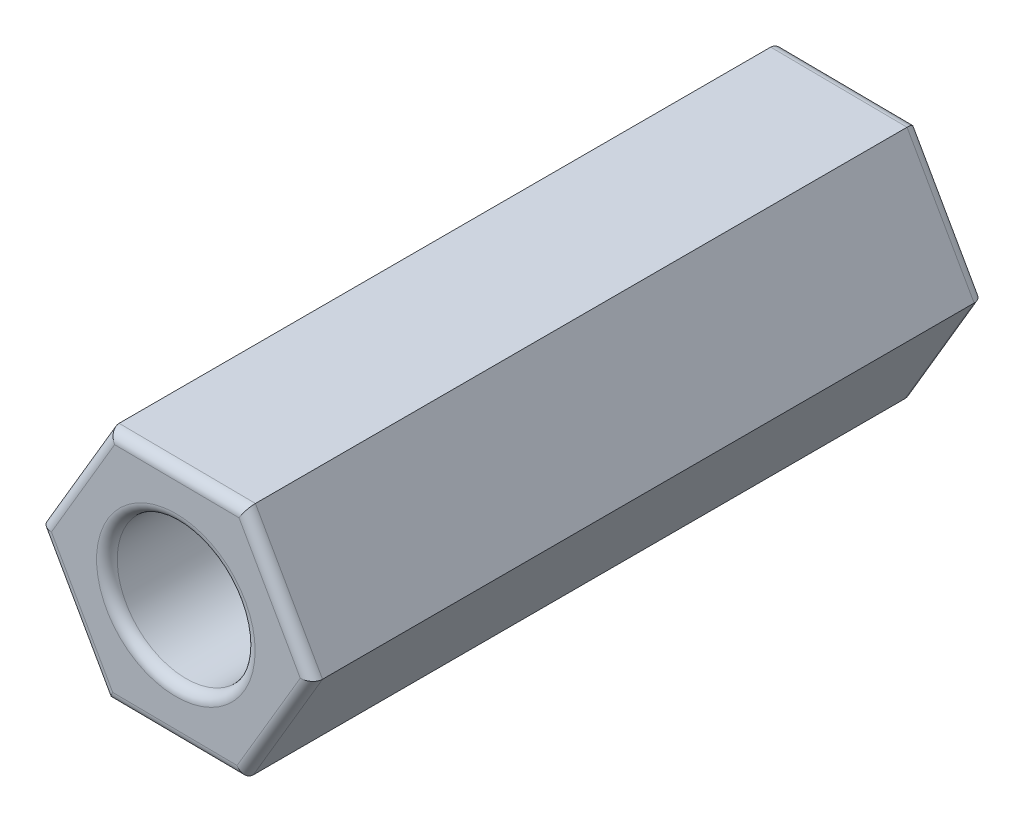
ISO-10303-21;
HEADER;
FILE_DESCRIPTION(('STEP AP214'),'2;1');
FILE_NAME('part.step','',(''),(''),'','','');
FILE_SCHEMA(('AUTOMOTIVE_DESIGN { 1 0 10303 214 1 1 1 1 }'));
ENDSEC;
DATA;
#1=APPLICATION_CONTEXT('core data for automotive mechanical design processes');
#2=APPLICATION_PROTOCOL_DEFINITION('international standard','automotive_design',2000,#1);
#3=PRODUCT_CONTEXT('',#1,'mechanical');
#4=PRODUCT('Part','Part','',(#3));
#5=PRODUCT_RELATED_PRODUCT_CATEGORY('part','',(#4));
#6=PRODUCT_DEFINITION_FORMATION('','',#4);
#7=PRODUCT_DEFINITION_CONTEXT('part definition',#1,'design');
#8=PRODUCT_DEFINITION('design','',#6,#7);
#9=PRODUCT_DEFINITION_SHAPE('','',#8);
#10=(LENGTH_UNIT() NAMED_UNIT(*) SI_UNIT(.MILLI.,.METRE.));
#11=(NAMED_UNIT(*) PLANE_ANGLE_UNIT() SI_UNIT($,.RADIAN.));
#12=(NAMED_UNIT(*) SI_UNIT($,.STERADIAN.) SOLID_ANGLE_UNIT());
#13=UNCERTAINTY_MEASURE_WITH_UNIT(LENGTH_MEASURE(1.E-05),#10,'distance_accuracy_value','');
#14=(GEOMETRIC_REPRESENTATION_CONTEXT(3) GLOBAL_UNCERTAINTY_ASSIGNED_CONTEXT((#13)) GLOBAL_UNIT_ASSIGNED_CONTEXT((#10,
#11,#12)) REPRESENTATION_CONTEXT('',''));
#15=CARTESIAN_POINT('',(0.,0.,0.));
#16=DIRECTION('',(0.,0.,1.));
#17=DIRECTION('',(1.,0.,0.));
#18=AXIS2_PLACEMENT_3D('',#15,#16,#17);
#19=CARTESIAN_POINT('',(-1.3228756555323,1.5,7.));
#20=DIRECTION('',(0.,1.,0.));
#21=DIRECTION('',(0.,0.,1.));
#22=AXIS2_PLACEMENT_3D('',#19,#20,#21);
#23=PLANE('',#22);
#24=DIRECTION('',(0.,0.,1.));
#25=VECTOR('',#24,1.);
#26=CARTESIAN_POINT('',(1.3228756555323,1.5,7.));
#27=LINE('',#26,#25);
#28=CARTESIAN_POINT('',(1.3228756555323,1.5,7.));
#29=VERTEX_POINT('',#28);
#30=CARTESIAN_POINT('',(1.3228756555323,1.5,15.3));
#31=VERTEX_POINT('',#30);
#32=EDGE_CURVE('E143',#29,#31,#27,.T.);
#33=ORIENTED_EDGE('',*,*,#32,.T.);
#34=DIRECTION('',(1.,0.,0.));
#35=VECTOR('',#34,1.);
#36=CARTESIAN_POINT('',(-1.3228756555323,1.5,15.3));
#37=LINE('',#36,#35);
#38=CARTESIAN_POINT('',(-1.3228756555323,1.5,15.3));
#39=VERTEX_POINT('',#38);
#40=EDGE_CURVE('E61',#31,#39,#37,.F.);
#41=ORIENTED_EDGE('',*,*,#40,.T.);
#42=DIRECTION('',(0.,0.,1.));
#43=VECTOR('',#42,1.);
#44=CARTESIAN_POINT('',(-1.3228756555323,1.5,7.));
#45=LINE('',#44,#43);
#46=CARTESIAN_POINT('',(-1.3228756555323,1.5,7.));
#47=VERTEX_POINT('',#46);
#48=EDGE_CURVE('E149',#47,#39,#45,.T.);
#49=ORIENTED_EDGE('',*,*,#48,.F.);
#50=DIRECTION('',(-1.,0.,0.));
#51=VECTOR('',#50,1.);
#52=CARTESIAN_POINT('',(-1.3228756555323,1.5,7.));
#53=LINE('',#52,#51);
#54=EDGE_CURVE('E150',#29,#47,#53,.T.);
#55=ORIENTED_EDGE('',*,*,#54,.F.);
#56=EDGE_LOOP('',(#33,#41,#49,#55));
#57=FACE_BOUND('',#56,.T.);
#58=ADVANCED_FACE('F35',(#57),#23,.F.);
#59=CARTESIAN_POINT('',(3.95468757395786,-0.0357704587140529,19.5));
#60=DIRECTION('',(-0.87051233385229,-0.492146600730961,0.));
#61=DIRECTION('',(0.492146600730961,-0.87051233385229,0.));
#62=AXIS2_PLACEMENT_3D('',#59,#60,#61);
#63=PLANE('',#62);
#64=DIRECTION('',(0.,0.,-1.));
#65=VECTOR('',#64,1.);
#66=CARTESIAN_POINT('',(3.95468757395786,-0.0357704587140529,19.5));
#67=LINE('',#66,#65);
#68=CARTESIAN_POINT('',(3.95468757395786,-0.0357704587140529,19.2));
#69=VERTEX_POINT('',#68);
#70=CARTESIAN_POINT('',(3.95468757395786,-0.0357704587140529,0.300000000000002));
#71=VERTEX_POINT('',#70);
#72=EDGE_CURVE('E159',#69,#71,#67,.T.);
#73=ORIENTED_EDGE('',*,*,#72,.T.);
#74=DIRECTION('',(-0.492146600730961,0.87051233385229,0.));
#75=VECTOR('',#74,1.);
#76=CARTESIAN_POINT('',(3.95468757395786,-0.0357704587140529,0.300000000000002));
#77=LINE('',#76,#75);
#78=CARTESIAN_POINT('',(2.00832191293032,3.40697467372113,0.300000000000002));
#79=VERTEX_POINT('',#78);
#80=EDGE_CURVE('E215',#71,#79,#77,.T.);
#81=ORIENTED_EDGE('',*,*,#80,.T.);
#82=DIRECTION('',(0.,0.,-1.));
#83=VECTOR('',#82,1.);
#84=CARTESIAN_POINT('',(2.00832191293032,3.40697467372113,19.5));
#85=LINE('',#84,#83);
#86=CARTESIAN_POINT('',(2.00832191293032,3.40697467372113,19.2));
#87=VERTEX_POINT('',#86);
#88=EDGE_CURVE('E175',#87,#79,#85,.T.);
#89=ORIENTED_EDGE('',*,*,#88,.F.);
#90=DIRECTION('',(-0.492146600730961,0.87051233385229,0.));
#91=VECTOR('',#90,1.);
#92=CARTESIAN_POINT('',(3.95468757395786,-0.0357704587140529,19.2));
#93=LINE('',#92,#91);
#94=EDGE_CURVE('E213',#87,#69,#93,.F.);
#95=ORIENTED_EDGE('',*,*,#94,.T.);
#96=EDGE_LOOP('',(#73,#81,#89,#95));
#97=FACE_BOUND('',#96,.T.);
#98=ADVANCED_FACE('F308',(#97),#63,.F.);
#99=CARTESIAN_POINT('',(2.00832191293032,3.40697467372113,19.5));
#100=DIRECTION('',(-0.00904470830697618,-0.999959095789244,0.));
#101=DIRECTION('',(0.999959095789244,-0.00904470830697618,0.));
#102=AXIS2_PLACEMENT_3D('',#99,#100,#101);
#103=PLANE('',#102);
#104=ORIENTED_EDGE('',*,*,#88,.T.);
#105=DIRECTION('',(-0.999959095789244,0.00904470830697618,0.));
#106=VECTOR('',#105,1.);
#107=CARTESIAN_POINT('',(2.00832191293032,3.40697467372113,0.300000000000002));
#108=LINE('',#107,#106);
#109=CARTESIAN_POINT('',(-1.94636566102754,3.44274513243519,0.300000000000002));
#110=VERTEX_POINT('',#109);
#111=EDGE_CURVE('E180',#79,#110,#108,.T.);
#112=ORIENTED_EDGE('',*,*,#111,.T.);
#113=DIRECTION('',(0.,0.,-1.));
#114=VECTOR('',#113,1.);
#115=CARTESIAN_POINT('',(-1.94636566102754,3.44274513243519,19.5));
#116=LINE('',#115,#114);
#117=CARTESIAN_POINT('',(-1.94636566102754,3.44274513243519,19.2));
#118=VERTEX_POINT('',#117);
#119=EDGE_CURVE('E172',#118,#110,#116,.T.);
#120=ORIENTED_EDGE('',*,*,#119,.F.);
#121=DIRECTION('',(-0.999959095789244,0.00904470830697618,0.));
#122=VECTOR('',#121,1.);
#123=CARTESIAN_POINT('',(2.00832191293032,3.40697467372113,19.2));
#124=LINE('',#123,#122);
#125=EDGE_CURVE('E178',#118,#87,#124,.F.);
#126=ORIENTED_EDGE('',*,*,#125,.T.);
#127=EDGE_LOOP('',(#104,#112,#120,#126));
#128=FACE_BOUND('',#127,.T.);
#129=ADVANCED_FACE('F304',(#128),#103,.F.);
#130=CARTESIAN_POINT('',(-1.94636566102754,3.44274513243519,19.5));
#131=DIRECTION('',(0.861467625545314,-0.507812495058283,0.));
#132=DIRECTION('',(0.507812495058283,0.861467625545314,0.));
#133=AXIS2_PLACEMENT_3D('',#130,#131,#132);
#134=PLANE('',#133);
#135=ORIENTED_EDGE('',*,*,#119,.T.);
#136=DIRECTION('',(-0.507812495058283,-0.861467625545314,0.));
#137=VECTOR('',#136,1.);
#138=CARTESIAN_POINT('',(-1.94636566102754,3.44274513243519,0.300000000000002));
#139=LINE('',#138,#137);
#140=CARTESIAN_POINT('',(-3.95468757395786,0.0357704587140536,0.300000000000002));
#141=VERTEX_POINT('',#140);
#142=EDGE_CURVE('E198',#110,#141,#139,.T.);
#143=ORIENTED_EDGE('',*,*,#142,.T.);
#144=DIRECTION('',(0.,0.,-1.));
#145=VECTOR('',#144,1.);
#146=CARTESIAN_POINT('',(-3.95468757395786,0.0357704587140536,19.5));
#147=LINE('',#146,#145);
#148=CARTESIAN_POINT('',(-3.95468757395786,0.0357704587140536,19.2));
#149=VERTEX_POINT('',#148);
#150=EDGE_CURVE('E169',#149,#141,#147,.T.);
#151=ORIENTED_EDGE('',*,*,#150,.F.);
#152=DIRECTION('',(-0.507812495058283,-0.861467625545314,0.));
#153=VECTOR('',#152,1.);
#154=CARTESIAN_POINT('',(-1.94636566102754,3.44274513243519,19.2));
#155=LINE('',#154,#153);
#156=EDGE_CURVE('E196',#149,#118,#155,.F.);
#157=ORIENTED_EDGE('',*,*,#156,.T.);
#158=EDGE_LOOP('',(#135,#143,#151,#157));
#159=FACE_BOUND('',#158,.T.);
#160=ADVANCED_FACE('F300',(#159),#134,.F.);
#161=CARTESIAN_POINT('',(-3.95468757395786,0.0357704587140536,19.5));
#162=DIRECTION('',(0.87051233385229,0.49214660073096,0.));
#163=DIRECTION('',(-0.49214660073096,0.87051233385229,0.));
#164=AXIS2_PLACEMENT_3D('',#161,#162,#163);
#165=PLANE('',#164);
#166=ORIENTED_EDGE('',*,*,#150,.T.);
#167=DIRECTION('',(0.49214660073096,-0.87051233385229,0.));
#168=VECTOR('',#167,1.);
#169=CARTESIAN_POINT('',(-3.95468757395786,0.0357704587140536,0.300000000000002));
#170=LINE('',#169,#168);
#171=CARTESIAN_POINT('',(-2.00832191293032,-3.40697467372113,0.300000000000002));
#172=VERTEX_POINT('',#171);
#173=EDGE_CURVE('E202',#141,#172,#170,.T.);
#174=ORIENTED_EDGE('',*,*,#173,.T.);
#175=DIRECTION('',(0.,0.,-1.));
#176=VECTOR('',#175,1.);
#177=CARTESIAN_POINT('',(-2.00832191293032,-3.40697467372113,19.5));
#178=LINE('',#177,#176);
#179=CARTESIAN_POINT('',(-2.00832191293032,-3.40697467372113,19.2));
#180=VERTEX_POINT('',#179);
#181=EDGE_CURVE('E166',#180,#172,#178,.T.);
#182=ORIENTED_EDGE('',*,*,#181,.F.);
#183=DIRECTION('',(0.49214660073096,-0.87051233385229,0.));
#184=VECTOR('',#183,1.);
#185=CARTESIAN_POINT('',(-3.95468757395786,0.0357704587140535,19.2));
#186=LINE('',#185,#184);
#187=EDGE_CURVE('E200',#180,#149,#186,.F.);
#188=ORIENTED_EDGE('',*,*,#187,.T.);
#189=EDGE_LOOP('',(#166,#174,#182,#188));
#190=FACE_BOUND('',#189,.T.);
#191=ADVANCED_FACE('F296',(#190),#165,.F.);
#192=CARTESIAN_POINT('',(-2.00832191293032,-3.40697467372113,19.5));
#193=DIRECTION('',(0.00904470830697596,0.999959095789244,0.));
#194=DIRECTION('',(-0.999959095789244,0.00904470830697596,0.));
#195=AXIS2_PLACEMENT_3D('',#192,#193,#194);
#196=PLANE('',#195);
#197=ORIENTED_EDGE('',*,*,#181,.T.);
#198=DIRECTION('',(0.999959095789244,-0.00904470830697596,0.));
#199=VECTOR('',#198,1.);
#200=CARTESIAN_POINT('',(-2.00832191293032,-3.40697467372113,0.300000000000002));
#201=LINE('',#200,#199);
#202=CARTESIAN_POINT('',(1.94636566102754,-3.44274513243519,0.300000000000002));
#203=VERTEX_POINT('',#202);
#204=EDGE_CURVE('E206',#172,#203,#201,.T.);
#205=ORIENTED_EDGE('',*,*,#204,.T.);
#206=DIRECTION('',(0.,0.,-1.));
#207=VECTOR('',#206,1.);
#208=CARTESIAN_POINT('',(1.94636566102754,-3.44274513243519,19.5));
#209=LINE('',#208,#207);
#210=CARTESIAN_POINT('',(1.94636566102754,-3.44274513243519,19.2));
#211=VERTEX_POINT('',#210);
#212=EDGE_CURVE('E163',#211,#203,#209,.T.);
#213=ORIENTED_EDGE('',*,*,#212,.F.);
#214=DIRECTION('',(0.999959095789244,-0.00904470830697596,0.));
#215=VECTOR('',#214,1.);
#216=CARTESIAN_POINT('',(-2.00832191293033,-3.40697467372113,19.2));
#217=LINE('',#216,#215);
#218=EDGE_CURVE('E204',#211,#180,#217,.F.);
#219=ORIENTED_EDGE('',*,*,#218,.T.);
#220=EDGE_LOOP('',(#197,#205,#213,#219));
#221=FACE_BOUND('',#220,.T.);
#222=ADVANCED_FACE('F292',(#221),#196,.F.);
#223=CARTESIAN_POINT('',(1.94636566102754,-3.44274513243519,19.5));
#224=DIRECTION('',(-0.861467625545314,0.507812495058283,0.));
#225=DIRECTION('',(-0.507812495058283,-0.861467625545314,0.));
#226=AXIS2_PLACEMENT_3D('',#223,#224,#225);
#227=PLANE('',#226);
#228=ORIENTED_EDGE('',*,*,#212,.T.);
#229=DIRECTION('',(0.507812495058283,0.861467625545314,0.));
#230=VECTOR('',#229,1.);
#231=CARTESIAN_POINT('',(1.94636566102754,-3.44274513243519,0.300000000000002));
#232=LINE('',#231,#230);
#233=EDGE_CURVE('E211',#203,#71,#232,.T.);
#234=ORIENTED_EDGE('',*,*,#233,.T.);
#235=ORIENTED_EDGE('',*,*,#72,.F.);
#236=DIRECTION('',(0.507812495058283,0.861467625545314,0.));
#237=VECTOR('',#236,1.);
#238=CARTESIAN_POINT('',(1.94636566102754,-3.44274513243519,19.2));
#239=LINE('',#238,#237);
#240=EDGE_CURVE('E208',#69,#211,#239,.F.);
#241=ORIENTED_EDGE('',*,*,#240,.T.);
#242=EDGE_LOOP('',(#228,#234,#235,#241));
#243=FACE_BOUND('',#242,.T.);
#244=ADVANCED_FACE('F285',(#243),#227,.F.);
#245=CARTESIAN_POINT('',(0.,0.,19.5));
#246=DIRECTION('',(0.,0.,1.));
#247=DIRECTION('',(1.,0.,0.));
#248=AXIS2_PLACEMENT_3D('',#245,#246,#247);
#249=PLANE('',#248);
#250=DIRECTION('',(0.999959095789244,-0.00904470830697596,0.));
#251=VECTOR('',#250,1.);
#252=CARTESIAN_POINT('',(1.94907907351963,-3.14275740369841,19.5));
#253=LINE('',#252,#251);
#254=CARTESIAN_POINT('',(-1.83241050449847,-3.10855353441709,19.5));
#255=VERTEX_POINT('',#254);
#256=CARTESIAN_POINT('',(1.77588107757987,-3.14119081426568,19.5));
#257=VERTEX_POINT('',#256);
#258=EDGE_CURVE('E228',#255,#257,#253,.T.);
#259=ORIENTED_EDGE('',*,*,#258,.T.);
#260=DIRECTION('',(0.507812495058283,0.861467625545314,0.));
#261=VECTOR('',#260,1.);
#262=CARTESIAN_POINT('',(3.69624728629427,0.116573289803433,19.5));
#263=LINE('',#262,#261);
#264=CARTESIAN_POINT('',(3.60829158207834,-0.0326372798485885,19.5));
#265=VERTEX_POINT('',#264);
#266=EDGE_CURVE('E230',#257,#265,#263,.T.);
#267=ORIENTED_EDGE('',*,*,#266,.T.);
#268=DIRECTION('',(-0.492146600730961,0.87051233385229,0.));
#269=VECTOR('',#268,1.);
#270=CARTESIAN_POINT('',(1.74716821277464,3.25933069350185,19.5));
#271=LINE('',#270,#269);
#272=CARTESIAN_POINT('',(1.83241050449847,3.10855353441709,19.5));
#273=VERTEX_POINT('',#272);
#274=EDGE_CURVE('E220',#265,#273,#271,.T.);
#275=ORIENTED_EDGE('',*,*,#274,.T.);
#276=DIRECTION('',(-0.999959095789244,0.00904470830697618,0.));
#277=VECTOR('',#276,1.);
#278=CARTESIAN_POINT('',(-1.94907907351963,3.14275740369841,19.5));
#279=LINE('',#278,#277);
#280=CARTESIAN_POINT('',(-1.77588107757987,3.14119081426568,19.5));
#281=VERTEX_POINT('',#280);
#282=EDGE_CURVE('E222',#273,#281,#279,.T.);
#283=ORIENTED_EDGE('',*,*,#282,.T.);
#284=DIRECTION('',(-0.507812495058283,-0.861467625545314,0.));
#285=VECTOR('',#284,1.);
#286=CARTESIAN_POINT('',(-3.69624728629427,-0.116573289803431,19.5));
#287=LINE('',#286,#285);
#288=CARTESIAN_POINT('',(-3.60829158207834,0.0326372798485892,19.5));
#289=VERTEX_POINT('',#288);
#290=EDGE_CURVE('E224',#281,#289,#287,.T.);
#291=ORIENTED_EDGE('',*,*,#290,.T.);
#292=DIRECTION('',(0.49214660073096,-0.87051233385229,0.));
#293=VECTOR('',#292,1.);
#294=CARTESIAN_POINT('',(-1.74716821277464,-3.25933069350184,19.5));
#295=LINE('',#294,#293);
#296=EDGE_CURVE('E226',#289,#255,#295,.T.);
#297=ORIENTED_EDGE('',*,*,#296,.T.);
#298=EDGE_LOOP('',(#259,#267,#275,#283,#291,#297));
#299=FACE_BOUND('',#298,.T.);
#300=CARTESIAN_POINT('',(0.,0.,19.5));
#301=DIRECTION('',(0.,0.,1.));
#302=DIRECTION('',(1.,0.,0.));
#303=AXIS2_PLACEMENT_3D('',#300,#301,#302);
#304=CIRCLE('',#303,2.3);
#305=CARTESIAN_POINT('',(2.3,0.,19.5));
#306=VERTEX_POINT('',#305);
#307=EDGE_CURVE('E217',#306,#306,#304,.F.);
#308=ORIENTED_EDGE('',*,*,#307,.T.);
#309=EDGE_LOOP('',(#308));
#310=FACE_BOUND('',#309,.T.);
#311=ADVANCED_FACE('F281',(#299,#310),#249,.T.);
#312=CARTESIAN_POINT('',(0.,0.,0.));
#313=DIRECTION('',(0.,0.,1.));
#314=DIRECTION('',(1.,0.,0.));
#315=AXIS2_PLACEMENT_3D('',#312,#313,#314);
#316=PLANE('',#315);
#317=DIRECTION('',(-0.507812495058283,-0.861467625545314,0.));
#318=VECTOR('',#317,1.);
#319=CARTESIAN_POINT('',(-2.69208632982911,1.58691404705714,0.));
#320=LINE('',#319,#318);
#321=CARTESIAN_POINT('',(-3.60829158207834,0.0326372798485891,0.));
#322=VERTEX_POINT('',#321);
#323=CARTESIAN_POINT('',(-1.77588107757987,3.14119081426568,0.));
#324=VERTEX_POINT('',#323);
#325=EDGE_CURVE('E191',#322,#324,#320,.F.);
#326=ORIENTED_EDGE('',*,*,#325,.T.);
#327=DIRECTION('',(-0.999959095789244,0.00904470830697618,0.));
#328=VECTOR('',#327,1.);
#329=CARTESIAN_POINT('',(0.0282647134593006,3.12487217434139,0.));
#330=LINE('',#329,#328);
#331=CARTESIAN_POINT('',(1.83241050449847,3.10855353441709,0.));
#332=VERTEX_POINT('',#331);
#333=EDGE_CURVE('E193',#324,#332,#330,.F.);
#334=ORIENTED_EDGE('',*,*,#333,.T.);
#335=DIRECTION('',(-0.492146600730961,0.87051233385229,0.));
#336=VECTOR('',#335,1.);
#337=CARTESIAN_POINT('',(2.72035104328841,1.53795812728425,0.));
#338=LINE('',#337,#336);
#339=CARTESIAN_POINT('',(3.60829158207834,-0.0326372798485882,0.));
#340=VERTEX_POINT('',#339);
#341=EDGE_CURVE('E183',#332,#340,#338,.F.);
#342=ORIENTED_EDGE('',*,*,#341,.T.);
#343=DIRECTION('',(0.507812495058283,0.861467625545314,0.));
#344=VECTOR('',#343,1.);
#345=CARTESIAN_POINT('',(2.69208632982911,-1.58691404705714,0.));
#346=LINE('',#345,#344);
#347=CARTESIAN_POINT('',(1.77588107757987,-3.14119081426568,0.));
#348=VERTEX_POINT('',#347);
#349=EDGE_CURVE('E185',#340,#348,#346,.F.);
#350=ORIENTED_EDGE('',*,*,#349,.T.);
#351=DIRECTION('',(0.999959095789244,-0.00904470830697596,0.));
#352=VECTOR('',#351,1.);
#353=CARTESIAN_POINT('',(-0.0282647134592999,-3.12487217434139,0.));
#354=LINE('',#353,#352);
#355=CARTESIAN_POINT('',(-1.83241050449847,-3.10855353441709,0.));
#356=VERTEX_POINT('',#355);
#357=EDGE_CURVE('E187',#348,#356,#354,.F.);
#358=ORIENTED_EDGE('',*,*,#357,.T.);
#359=DIRECTION('',(0.49214660073096,-0.87051233385229,0.));
#360=VECTOR('',#359,1.);
#361=CARTESIAN_POINT('',(-2.72035104328841,-1.53795812728425,0.));
#362=LINE('',#361,#360);
#363=EDGE_CURVE('E189',#356,#322,#362,.F.);
#364=ORIENTED_EDGE('',*,*,#363,.T.);
#365=EDGE_LOOP('',(#326,#334,#342,#350,#358,#364));
#366=FACE_BOUND('',#365,.T.);
#367=ADVANCED_FACE('F278',(#366),#316,.F.);
#368=CARTESIAN_POINT('',(0.,0.,7.));
#369=DIRECTION('',(0.,0.,1.));
#370=DIRECTION('',(1.,0.,0.));
#371=AXIS2_PLACEMENT_3D('',#368,#369,#370);
#372=CYLINDRICAL_SURFACE('',#371,2.);
#373=CARTESIAN_POINT('',(0.,0.,19.2));
#374=DIRECTION('',(0.,0.,1.));
#375=DIRECTION('',(1.,0.,0.));
#376=AXIS2_PLACEMENT_3D('',#373,#374,#375);
#377=CIRCLE('',#376,2.);
#378=CARTESIAN_POINT('',(2.,0.,19.2));
#379=VERTEX_POINT('',#378);
#380=EDGE_CURVE('E233',#379,#379,#377,.T.);
#381=ORIENTED_EDGE('',*,*,#380,.T.);
#382=EDGE_LOOP('',(#381));
#383=FACE_BOUND('',#382,.T.);
#384=CARTESIAN_POINT('',(0.,0.,15.5));
#385=DIRECTION('',(0.,0.,1.));
#386=DIRECTION('',(1.,0.,0.));
#387=AXIS2_PLACEMENT_3D('',#384,#385,#386);
#388=CIRCLE('',#387,2.);
#389=CARTESIAN_POINT('',(1.05356537528527,1.7,15.5));
#390=VERTEX_POINT('',#389);
#391=CARTESIAN_POINT('',(-1.05356537528527,1.7,15.5));
#392=VERTEX_POINT('',#391);
#393=EDGE_CURVE('E154',#390,#392,#388,.T.);
#394=ORIENTED_EDGE('',*,*,#393,.F.);
#395=CARTESIAN_POINT('',(1.05356537528527,1.7,15.5));
#396=CARTESIAN_POINT('',(1.06542383167928,1.69265040174794,15.4999959800596));
#397=CARTESIAN_POINT('',(1.07719911084702,1.68518083808708,15.4995950859389));
#398=CARTESIAN_POINT('',(1.1005814656983,1.6700049645867,15.4978865999542));
#399=CARTESIAN_POINT('',(1.1121878842263,1.66229797494747,15.4965761169805));
#400=CARTESIAN_POINT('',(1.14691168027369,1.63871149374413,15.4910696593345));
#401=CARTESIAN_POINT('',(1.1696478060508,1.6225436453875,15.4852931107751));
#402=CARTESIAN_POINT('',(1.20267345921063,1.59805458193214,15.4723271209399));
#403=CARTESIAN_POINT('',(1.21371503710819,1.5896788862866,15.4671348185759));
#404=CARTESIAN_POINT('',(1.23499143559525,1.57320533952609,15.4550081787383));
#405=CARTESIAN_POINT('',(1.24522868418063,1.56510669744754,15.448079371218));
#406=CARTESIAN_POINT('',(1.26272761612275,1.55100634480754,15.4337232142346));
#407=CARTESIAN_POINT('',(1.27018490048142,1.54489878365596,15.4266413728896));
#408=CARTESIAN_POINT('',(1.28407499513779,1.53337287211344,15.4110367143961));
#409=CARTESIAN_POINT('',(1.29050898076209,1.52795373248637,15.4025155739263));
#410=CARTESIAN_POINT('',(1.3004553210907,1.51948906996352,15.386458122516));
#411=CARTESIAN_POINT('',(1.30429071648532,1.51619444737073,15.3792545697363));
#412=CARTESIAN_POINT('',(1.31100798698687,1.51038988103873,15.3641355875783));
#413=CARTESIAN_POINT('',(1.31389235583261,1.50787788609808,15.3562220903125));
#414=CARTESIAN_POINT('',(1.31836834886807,1.50396599089713,15.3403969642196));
#415=CARTESIAN_POINT('',(1.32003586047456,1.50250095596018,15.3325233975614));
#416=CARTESIAN_POINT('',(1.32230053882954,1.50050725693488,15.3164413914765));
#417=CARTESIAN_POINT('',(1.32288841620525,1.49998671993569,15.3082306615468));
#418=CARTESIAN_POINT('',(1.32287565553229,1.5,15.3));
#419=B_SPLINE_CURVE_WITH_KNOTS('',3,(#395,#396,#397,#398,#399,#400,#401,#402,#403,#404,#405,
#406,#407,#408,#409,#410,#411,#412,#413,#414,#415,#416,#417,#418),.UNSPECIFIED.,.F.,.F.,(4,2,2,
2,2,2,2,2,2,2,2,4),(0.,0.0418288348472845,0.0837912343042364,0.168717180283132,0.21302492911347,
0.257193332678175,0.29296050254024,0.328686290042747,0.354992029530297,0.381228232332011,
0.405641787214898,0.430264434013701),.UNSPECIFIED.);
#420=EDGE_CURVE('E48',#390,#31,#419,.T.);
#421=ORIENTED_EDGE('',*,*,#420,.T.);
#422=ORIENTED_EDGE('',*,*,#32,.F.);
#423=CARTESIAN_POINT('',(0.,0.,7.));
#424=DIRECTION('',(0.,0.,1.));
#425=DIRECTION('',(1.,0.,0.));
#426=AXIS2_PLACEMENT_3D('',#423,#424,#425);
#427=CIRCLE('',#426,2.);
#428=EDGE_CURVE('E146',#47,#29,#427,.T.);
#429=ORIENTED_EDGE('',*,*,#428,.F.);
#430=ORIENTED_EDGE('',*,*,#48,.T.);
#431=CARTESIAN_POINT('',(-1.3228756555323,1.5,15.3));
#432=CARTESIAN_POINT('',(-1.32289039587147,1.49998470870932,15.3085291848443));
#433=CARTESIAN_POINT('',(-1.32225823350641,1.50054458797026,15.317035706924));
#434=CARTESIAN_POINT('',(-1.3198293524752,1.5026825357177,15.333672490995));
#435=CARTESIAN_POINT('',(-1.31804328589251,1.50425129033217,15.3418054729557));
#436=CARTESIAN_POINT('',(-1.31343843465207,1.50827322549161,15.3575058869253));
#437=CARTESIAN_POINT('',(-1.31062266150812,1.51072382662851,15.3650748914309));
#438=CARTESIAN_POINT('',(-1.30412130200982,1.51633976857248,15.3795571881571));
#439=CARTESIAN_POINT('',(-1.30043367211624,1.519506787822,15.3864688855226));
#440=CARTESIAN_POINT('',(-1.29063638090911,1.527846271897,15.4023432448615));
#441=CARTESIAN_POINT('',(-1.2841627265522,1.53329969069985,15.4109329535141));
#442=CARTESIAN_POINT('',(-1.27017659471806,1.54490605841282,15.4266558951357));
#443=CARTESIAN_POINT('',(-1.26266252961278,1.55106007380578,15.433786860113));
#444=CARTESIAN_POINT('',(-1.24285566362891,1.56701688742266,15.4500105144579));
#445=CARTESIAN_POINT('',(-1.23007893763098,1.57708097875488,15.458251089252));
#446=CARTESIAN_POINT('',(-1.2033997793532,1.59753417371599,15.4722056770754));
#447=CARTESIAN_POINT('',(-1.1894920091312,1.60792465727982,15.4779067758778));
#448=CARTESIAN_POINT('',(-1.15575574896621,1.6324229765319,15.488874315297));
#449=CARTESIAN_POINT('',(-1.13561478901613,1.64650727842126,15.4932272242079));
#450=CARTESIAN_POINT('',(-1.10499765181165,1.6670722976271,15.4973915306075));
#451=CARTESIAN_POINT('',(-1.09480427996092,1.67378417736032,15.4983866291335));
#452=CARTESIAN_POINT('',(-1.07428288550328,1.6870283539783,15.4996891715788));
#453=CARTESIAN_POINT('',(-1.06395513183724,1.6935609464861,15.4999978242141));
#454=CARTESIAN_POINT('',(-1.05356537528527,1.7,15.5));
#455=B_SPLINE_CURVE_WITH_KNOTS('',3,(#431,#432,#433,#434,#435,#436,#437,#438,#439,#440,#441,
#442,#443,#444,#445,#446,#447,#448,#449,#450,#451,#452,#453,#454),.UNSPECIFIED.,.F.,.F.,(4,2,2,
2,2,2,2,2,2,2,2,4),(0.,0.0255099132136813,0.0507876369406328,0.0759920162389244,
0.101256068053408,0.137232111051664,0.173263669913695,0.227656596259569,0.28232305914508,
0.356887438960599,0.393608649258958,0.430265148294618),.UNSPECIFIED.);
#456=EDGE_CURVE('E11',#39,#392,#455,.T.);
#457=ORIENTED_EDGE('',*,*,#456,.T.);
#458=EDGE_LOOP('',(#394,#421,#422,#429,#430,#457));
#459=FACE_BOUND('',#458,.T.);
#460=ADVANCED_FACE('F145',(#383,#459),#372,.F.);
#461=CARTESIAN_POINT('',(0.,0.,7.));
#462=DIRECTION('',(0.,0.,1.));
#463=DIRECTION('',(1.,0.,0.));
#464=AXIS2_PLACEMENT_3D('',#461,#462,#463);
#465=PLANE('',#464);
#466=ORIENTED_EDGE('',*,*,#428,.T.);
#467=ORIENTED_EDGE('',*,*,#54,.T.);
#468=EDGE_LOOP('',(#466,#467));
#469=FACE_BOUND('',#468,.T.);
#470=ADVANCED_FACE('F153',(#469),#465,.T.);
#471=CARTESIAN_POINT('',(0.,0.,15.5));
#472=DIRECTION('',(0.,0.,1.));
#473=DIRECTION('',(1.,0.,0.));
#474=AXIS2_PLACEMENT_3D('',#471,#472,#473);
#475=PLANE('',#474);
#476=ORIENTED_EDGE('',*,*,#393,.T.);
#477=DIRECTION('',(1.,0.,0.));
#478=VECTOR('',#477,1.);
#479=CARTESIAN_POINT('',(1.3228756555323,1.7,15.5));
#480=LINE('',#479,#478);
#481=EDGE_CURVE('E236',#392,#390,#480,.T.);
#482=ORIENTED_EDGE('',*,*,#481,.T.);
#483=EDGE_LOOP('',(#476,#482));
#484=FACE_BOUND('',#483,.T.);
#485=ADVANCED_FACE('F337',(#484),#475,.T.);
#486=CARTESIAN_POINT('',(-2.00560850043823,-3.10698694498436,0.300000000000002));
#487=DIRECTION('',(0.999959095789244,-0.00904470830697596,0.));
#488=DIRECTION('',(0.00904470830697596,0.999959095789244,0.));
#489=AXIS2_PLACEMENT_3D('',#486,#487,#488);
#490=CYLINDRICAL_SURFACE('',#489,0.3);
#491=CARTESIAN_POINT('',(-1.83241050449847,-3.10855353441709,0.300000000000002));
#492=DIRECTION('',(0.861467625545314,-0.507812495058283,0.));
#493=DIRECTION('',(0.507812495058284,0.861467625545314,0.));
#494=AXIS2_PLACEMENT_3D('',#491,#492,#493);
#495=ELLIPSE('',#494,0.346410161513775,0.3);
#496=EDGE_CURVE('E248',#356,#172,#495,.F.);
#497=ORIENTED_EDGE('',*,*,#496,.F.);
#498=ORIENTED_EDGE('',*,*,#357,.F.);
#499=CARTESIAN_POINT('',(1.77588107757987,-3.14119081426568,0.300000000000002));
#500=DIRECTION('',(0.87051233385229,0.49214660073096,0.));
#501=DIRECTION('',(-0.492146600730961,0.87051233385229,0.));
#502=AXIS2_PLACEMENT_3D('',#499,#500,#501);
#503=ELLIPSE('',#502,0.346410161513775,0.3);
#504=EDGE_CURVE('E251',#203,#348,#503,.T.);
#505=ORIENTED_EDGE('',*,*,#504,.F.);
#506=ORIENTED_EDGE('',*,*,#204,.F.);
#507=EDGE_LOOP('',(#497,#498,#505,#506));
#508=FACE_BOUND('',#507,.T.);
#509=ADVANCED_FACE('F333',(#508),#490,.T.);
#510=CARTESIAN_POINT('',(1.68792537336394,-3.2904013839177,0.300000000000002));
#511=DIRECTION('',(0.507812495058283,0.861467625545314,0.));
#512=DIRECTION('',(-0.861467625545314,0.507812495058283,0.));
#513=AXIS2_PLACEMENT_3D('',#510,#511,#512);
#514=CYLINDRICAL_SURFACE('',#513,0.3);
#515=ORIENTED_EDGE('',*,*,#504,.T.);
#516=ORIENTED_EDGE('',*,*,#349,.F.);
#517=CARTESIAN_POINT('',(3.60829158207834,-0.0326372798485874,0.300000000000002));
#518=DIRECTION('',(0.00904470830697598,0.999959095789244,0.));
#519=DIRECTION('',(-0.999959095789244,0.00904470830697579,0.));
#520=AXIS2_PLACEMENT_3D('',#517,#518,#519);
#521=ELLIPSE('',#520,0.346410161513775,0.3);
#522=EDGE_CURVE('E245',#71,#340,#521,.T.);
#523=ORIENTED_EDGE('',*,*,#522,.F.);
#524=ORIENTED_EDGE('',*,*,#233,.F.);
#525=EDGE_LOOP('',(#515,#516,#523,#524));
#526=FACE_BOUND('',#525,.T.);
#527=ADVANCED_FACE('F329',(#526),#514,.T.);
#528=CARTESIAN_POINT('',(-3.69353387380218,0.183414438933342,0.300000000000002));
#529=DIRECTION('',(0.49214660073096,-0.87051233385229,0.));
#530=DIRECTION('',(0.87051233385229,0.49214660073096,0.));
#531=AXIS2_PLACEMENT_3D('',#528,#529,#530);
#532=CYLINDRICAL_SURFACE('',#531,0.3);
#533=ORIENTED_EDGE('',*,*,#496,.T.);
#534=ORIENTED_EDGE('',*,*,#173,.F.);
#535=CARTESIAN_POINT('',(-3.60829158207834,0.0326372798485886,0.300000000000002));
#536=DIRECTION('',(-0.00904470830697608,-0.999959095789244,0.));
#537=DIRECTION('',(0.999959095789244,-0.00904470830697602,0.));
#538=AXIS2_PLACEMENT_3D('',#535,#536,#537);
#539=ELLIPSE('',#538,0.346410161513775,0.3);
#540=EDGE_CURVE('E242',#322,#141,#539,.F.);
#541=ORIENTED_EDGE('',*,*,#540,.F.);
#542=ORIENTED_EDGE('',*,*,#363,.F.);
#543=EDGE_LOOP('',(#533,#534,#541,#542));
#544=FACE_BOUND('',#543,.T.);
#545=ADVANCED_FACE('F325',(#544),#532,.T.);
#546=CARTESIAN_POINT('',(3.69353387380218,-0.183414438933341,0.300000000000002));
#547=DIRECTION('',(-0.492146600730961,0.87051233385229,0.));
#548=DIRECTION('',(-0.87051233385229,-0.492146600730961,0.));
#549=AXIS2_PLACEMENT_3D('',#546,#547,#548);
#550=CYLINDRICAL_SURFACE('',#549,0.3);
#551=ORIENTED_EDGE('',*,*,#522,.T.);
#552=ORIENTED_EDGE('',*,*,#341,.F.);
#553=CARTESIAN_POINT('',(1.83241050449847,3.10855353441709,0.300000000000002));
#554=DIRECTION('',(-0.861467625545314,0.507812495058283,0.));
#555=DIRECTION('',(0.507812495058283,0.861467625545314,0.));
#556=AXIS2_PLACEMENT_3D('',#553,#554,#555);
#557=ELLIPSE('',#556,0.346410161513775,0.3);
#558=EDGE_CURVE('E239',#79,#332,#557,.T.);
#559=ORIENTED_EDGE('',*,*,#558,.F.);
#560=ORIENTED_EDGE('',*,*,#80,.F.);
#561=EDGE_LOOP('',(#551,#552,#559,#560));
#562=FACE_BOUND('',#561,.T.);
#563=ADVANCED_FACE('F321',(#562),#550,.T.);
#564=CARTESIAN_POINT('',(-1.68792537336394,3.2904013839177,0.300000000000002));
#565=DIRECTION('',(-0.507812495058283,-0.861467625545314,0.));
#566=DIRECTION('',(0.861467625545314,-0.507812495058283,0.));
#567=AXIS2_PLACEMENT_3D('',#564,#565,#566);
#568=CYLINDRICAL_SURFACE('',#567,0.3);
#569=ORIENTED_EDGE('',*,*,#540,.T.);
#570=ORIENTED_EDGE('',*,*,#142,.F.);
#571=CARTESIAN_POINT('',(-1.77588107757987,3.14119081426568,0.300000000000002));
#572=DIRECTION('',(-0.87051233385229,-0.49214660073096,0.));
#573=DIRECTION('',(0.49214660073096,-0.87051233385229,0.));
#574=AXIS2_PLACEMENT_3D('',#571,#572,#573);
#575=ELLIPSE('',#574,0.346410161513775,0.3);
#576=EDGE_CURVE('E237',#324,#110,#575,.F.);
#577=ORIENTED_EDGE('',*,*,#576,.F.);
#578=ORIENTED_EDGE('',*,*,#325,.F.);
#579=EDGE_LOOP('',(#569,#570,#577,#578));
#580=FACE_BOUND('',#579,.T.);
#581=ADVANCED_FACE('F317',(#580),#568,.T.);
#582=CARTESIAN_POINT('',(2.00560850043823,3.10698694498436,0.300000000000002));
#583=DIRECTION('',(-0.999959095789244,0.00904470830697618,0.));
#584=DIRECTION('',(-0.00904470830697618,-0.999959095789244,0.));
#585=AXIS2_PLACEMENT_3D('',#582,#583,#584);
#586=CYLINDRICAL_SURFACE('',#585,0.3);
#587=ORIENTED_EDGE('',*,*,#558,.T.);
#588=ORIENTED_EDGE('',*,*,#333,.F.);
#589=ORIENTED_EDGE('',*,*,#576,.T.);
#590=ORIENTED_EDGE('',*,*,#111,.F.);
#591=EDGE_LOOP('',(#587,#588,#589,#590));
#592=FACE_BOUND('',#591,.T.);
#593=ADVANCED_FACE('F313',(#592),#586,.T.);
#594=CARTESIAN_POINT('',(-2.69208632982911,1.58691404705714,19.2));
#595=DIRECTION('',(0.507812495058283,0.861467625545314,0.));
#596=DIRECTION('',(-0.861467625545314,0.507812495058283,0.));
#597=AXIS2_PLACEMENT_3D('',#594,#595,#596);
#598=CYLINDRICAL_SURFACE('',#597,0.3);
#599=CARTESIAN_POINT('',(-1.77588107757987,3.14119081426568,19.2));
#600=DIRECTION('',(0.87051233385229,0.49214660073096,0.));
#601=DIRECTION('',(0.49214660073096,-0.87051233385229,0.));
#602=AXIS2_PLACEMENT_3D('',#599,#600,#601);
#603=ELLIPSE('',#602,0.346410161513775,0.3);
#604=EDGE_CURVE('E264',#118,#281,#603,.T.);
#605=ORIENTED_EDGE('',*,*,#604,.F.);
#606=ORIENTED_EDGE('',*,*,#156,.F.);
#607=CARTESIAN_POINT('',(-3.60829158207834,0.0326372798485893,19.2));
#608=DIRECTION('',(0.00904470830697608,0.999959095789244,0.));
#609=DIRECTION('',(0.999959095789244,-0.00904470830697602,0.));
#610=AXIS2_PLACEMENT_3D('',#607,#608,#609);
#611=ELLIPSE('',#610,0.346410161513775,0.3);
#612=EDGE_CURVE('E240',#289,#149,#611,.F.);
#613=ORIENTED_EDGE('',*,*,#612,.F.);
#614=ORIENTED_EDGE('',*,*,#290,.F.);
#615=EDGE_LOOP('',(#605,#606,#613,#614));
#616=FACE_BOUND('',#615,.T.);
#617=ADVANCED_FACE('F316',(#616),#598,.T.);
#618=CARTESIAN_POINT('',(-2.72035104328841,-1.53795812728425,19.2));
#619=DIRECTION('',(-0.49214660073096,0.87051233385229,0.));
#620=DIRECTION('',(-0.87051233385229,-0.49214660073096,0.));
#621=AXIS2_PLACEMENT_3D('',#618,#619,#620);
#622=CYLINDRICAL_SURFACE('',#621,0.3);
#623=ORIENTED_EDGE('',*,*,#612,.T.);
#624=ORIENTED_EDGE('',*,*,#187,.F.);
#625=CARTESIAN_POINT('',(-1.83241050449847,-3.10855353441709,19.2));
#626=DIRECTION('',(-0.861467625545314,0.507812495058283,0.));
#627=DIRECTION('',(0.507812495058284,0.861467625545314,0.));
#628=AXIS2_PLACEMENT_3D('',#625,#626,#627);
#629=ELLIPSE('',#628,0.346410161513775,0.3);
#630=EDGE_CURVE('E261',#255,#180,#629,.F.);
#631=ORIENTED_EDGE('',*,*,#630,.F.);
#632=ORIENTED_EDGE('',*,*,#296,.F.);
#633=EDGE_LOOP('',(#623,#624,#631,#632));
#634=FACE_BOUND('',#633,.T.);
#635=ADVANCED_FACE('F355',(#634),#622,.T.);
#636=CARTESIAN_POINT('',(0.0282647134593006,3.12487217434139,19.2));
#637=DIRECTION('',(0.999959095789244,-0.00904470830697618,0.));
#638=DIRECTION('',(0.00904470830697618,0.999959095789244,0.));
#639=AXIS2_PLACEMENT_3D('',#636,#637,#638);
#640=CYLINDRICAL_SURFACE('',#639,0.3);
#641=ORIENTED_EDGE('',*,*,#604,.T.);
#642=ORIENTED_EDGE('',*,*,#282,.F.);
#643=CARTESIAN_POINT('',(1.83241050449847,3.10855353441709,19.2));
#644=DIRECTION('',(0.861467625545314,-0.507812495058283,0.));
#645=DIRECTION('',(-0.507812495058283,-0.861467625545314,0.));
#646=AXIS2_PLACEMENT_3D('',#643,#644,#645);
#647=ELLIPSE('',#646,0.346410161513775,0.3);
#648=EDGE_CURVE('E258',#87,#273,#647,.T.);
#649=ORIENTED_EDGE('',*,*,#648,.F.);
#650=ORIENTED_EDGE('',*,*,#125,.F.);
#651=EDGE_LOOP('',(#641,#642,#649,#650));
#652=FACE_BOUND('',#651,.T.);
#653=ADVANCED_FACE('F351',(#652),#640,.T.);
#654=CARTESIAN_POINT('',(-0.0282647134592999,-3.12487217434139,19.2));
#655=DIRECTION('',(-0.999959095789244,0.00904470830697596,0.));
#656=DIRECTION('',(-0.00904470830697596,-0.999959095789244,0.));
#657=AXIS2_PLACEMENT_3D('',#654,#655,#656);
#658=CYLINDRICAL_SURFACE('',#657,0.3);
#659=ORIENTED_EDGE('',*,*,#630,.T.);
#660=ORIENTED_EDGE('',*,*,#218,.F.);
#661=CARTESIAN_POINT('',(1.77588107757987,-3.14119081426568,19.2));
#662=DIRECTION('',(-0.87051233385229,-0.49214660073096,0.));
#663=DIRECTION('',(-0.492146600730961,0.87051233385229,0.));
#664=AXIS2_PLACEMENT_3D('',#661,#662,#663);
#665=ELLIPSE('',#664,0.346410161513775,0.3);
#666=EDGE_CURVE('E256',#257,#211,#665,.F.);
#667=ORIENTED_EDGE('',*,*,#666,.F.);
#668=ORIENTED_EDGE('',*,*,#258,.F.);
#669=EDGE_LOOP('',(#659,#660,#667,#668));
#670=FACE_BOUND('',#669,.T.);
#671=ADVANCED_FACE('F347',(#670),#658,.T.);
#672=CARTESIAN_POINT('',(2.72035104328841,1.53795812728425,19.2));
#673=DIRECTION('',(0.492146600730961,-0.87051233385229,0.));
#674=DIRECTION('',(0.87051233385229,0.492146600730961,0.));
#675=AXIS2_PLACEMENT_3D('',#672,#673,#674);
#676=CYLINDRICAL_SURFACE('',#675,0.3);
#677=ORIENTED_EDGE('',*,*,#648,.T.);
#678=ORIENTED_EDGE('',*,*,#274,.F.);
#679=CARTESIAN_POINT('',(3.60829158207834,-0.032637279848588,19.2));
#680=DIRECTION('',(-0.00904470830697598,-0.999959095789244,0.));
#681=DIRECTION('',(0.999959095789244,-0.00904470830697579,0.));
#682=AXIS2_PLACEMENT_3D('',#679,#680,#681);
#683=ELLIPSE('',#682,0.346410161513775,0.3);
#684=EDGE_CURVE('E254',#69,#265,#683,.T.);
#685=ORIENTED_EDGE('',*,*,#684,.F.);
#686=ORIENTED_EDGE('',*,*,#94,.F.);
#687=EDGE_LOOP('',(#677,#678,#685,#686));
#688=FACE_BOUND('',#687,.T.);
#689=ADVANCED_FACE('F343',(#688),#676,.T.);
#690=CARTESIAN_POINT('',(2.69208632982911,-1.58691404705714,19.2));
#691=DIRECTION('',(-0.507812495058283,-0.861467625545314,0.));
#692=DIRECTION('',(0.861467625545314,-0.507812495058283,0.));
#693=AXIS2_PLACEMENT_3D('',#690,#691,#692);
#694=CYLINDRICAL_SURFACE('',#693,0.3);
#695=ORIENTED_EDGE('',*,*,#666,.T.);
#696=ORIENTED_EDGE('',*,*,#240,.F.);
#697=ORIENTED_EDGE('',*,*,#684,.T.);
#698=ORIENTED_EDGE('',*,*,#266,.F.);
#699=EDGE_LOOP('',(#695,#696,#697,#698));
#700=FACE_BOUND('',#699,.T.);
#701=ADVANCED_FACE('F339',(#700),#694,.T.);
#702=CARTESIAN_POINT('',(0.,0.,19.2));
#703=DIRECTION('',(0.,0.,1.));
#704=DIRECTION('',(1.,0.,0.));
#705=AXIS2_PLACEMENT_3D('',#702,#703,#704);
#706=TOROIDAL_SURFACE('',#705,2.3,0.3);
#707=ORIENTED_EDGE('',*,*,#307,.F.);
#708=EDGE_LOOP('',(#707));
#709=FACE_BOUND('',#708,.T.);
#710=ORIENTED_EDGE('',*,*,#380,.F.);
#711=EDGE_LOOP('',(#710));
#712=FACE_BOUND('',#711,.T.);
#713=ADVANCED_FACE('F342',(#709,#712),#706,.T.);
#714=CARTESIAN_POINT('',(0.,1.7,15.3));
#715=DIRECTION('',(-1.,0.,0.));
#716=DIRECTION('',(0.,0.,1.));
#717=AXIS2_PLACEMENT_3D('',#714,#715,#716);
#718=CYLINDRICAL_SURFACE('',#717,0.2);
#719=ORIENTED_EDGE('',*,*,#456,.F.);
#720=ORIENTED_EDGE('',*,*,#40,.F.);
#721=ORIENTED_EDGE('',*,*,#420,.F.);
#722=ORIENTED_EDGE('',*,*,#481,.F.);
#723=EDGE_LOOP('',(#719,#720,#721,#722));
#724=FACE_BOUND('',#723,.T.);
#725=ADVANCED_FACE('F37',(#724),#718,.T.);
#726=CLOSED_SHELL('',(#58,#98,#129,#160,#191,#222,#244,#311,#367,#460,#470,#485,#509,#527,#545,
#563,#581,#593,#617,#635,#653,#671,#689,#701,#713,#725));
#727=MANIFOLD_SOLID_BREP('B2',#726);
#728=ADVANCED_BREP_SHAPE_REPRESENTATION('',(#18,#727),#14);
#729=SHAPE_DEFINITION_REPRESENTATION(#9,#728);
ENDSEC;
END-ISO-10303-21;
